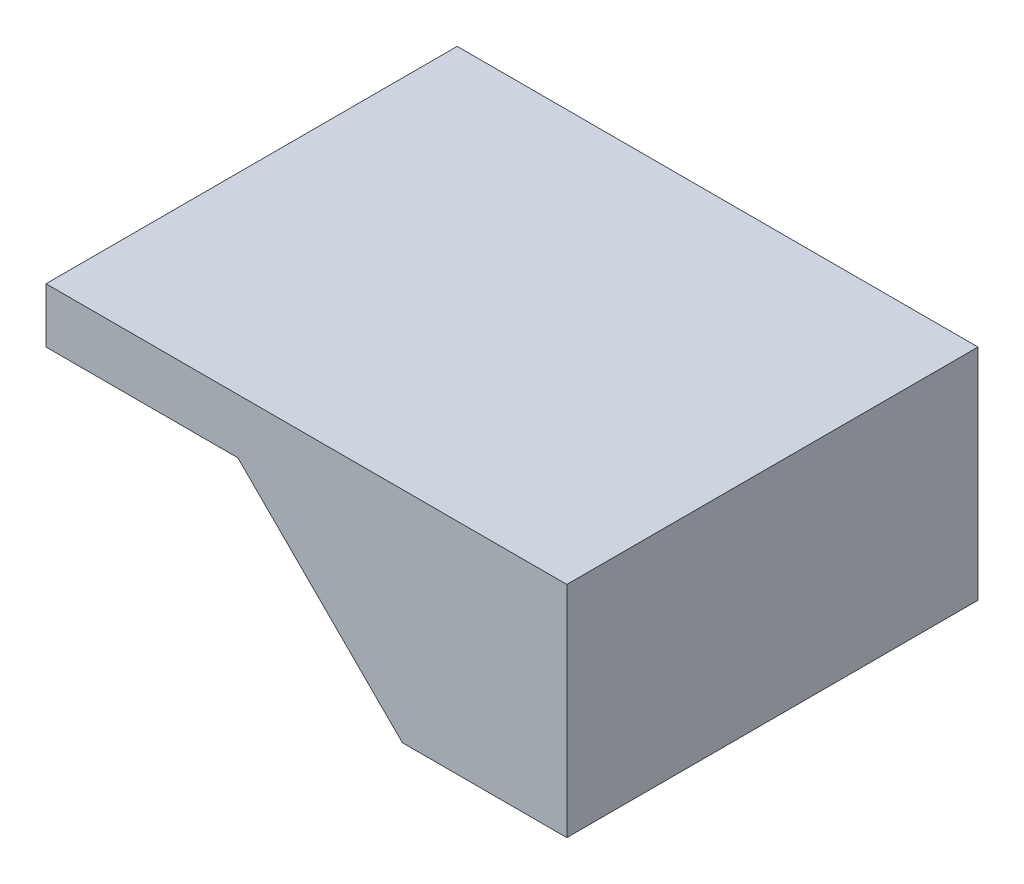
ISO-10303-21;
HEADER;
FILE_DESCRIPTION(('STEP AP214'),'2;1');
FILE_NAME('part.step','',(''),(''),'','','');
FILE_SCHEMA(('AUTOMOTIVE_DESIGN { 1 0 10303 214 1 1 1 1 }'));
ENDSEC;
DATA;
#1=APPLICATION_CONTEXT('core data for automotive mechanical design processes');
#2=APPLICATION_PROTOCOL_DEFINITION('international standard','automotive_design',2000,#1);
#3=PRODUCT_CONTEXT('',#1,'mechanical');
#4=PRODUCT('Part','Part','',(#3));
#5=PRODUCT_RELATED_PRODUCT_CATEGORY('part','',(#4));
#6=PRODUCT_DEFINITION_FORMATION('','',#4);
#7=PRODUCT_DEFINITION_CONTEXT('part definition',#1,'design');
#8=PRODUCT_DEFINITION('design','',#6,#7);
#9=PRODUCT_DEFINITION_SHAPE('','',#8);
#10=(LENGTH_UNIT() NAMED_UNIT(*) SI_UNIT(.MILLI.,.METRE.));
#11=(NAMED_UNIT(*) PLANE_ANGLE_UNIT() SI_UNIT($,.RADIAN.));
#12=(NAMED_UNIT(*) SI_UNIT($,.STERADIAN.) SOLID_ANGLE_UNIT());
#13=UNCERTAINTY_MEASURE_WITH_UNIT(LENGTH_MEASURE(1.E-05),#10,'distance_accuracy_value','');
#14=(GEOMETRIC_REPRESENTATION_CONTEXT(3) GLOBAL_UNCERTAINTY_ASSIGNED_CONTEXT((#13)) GLOBAL_UNIT_ASSIGNED_CONTEXT((#10,
#11,#12)) REPRESENTATION_CONTEXT('',''));
#15=CARTESIAN_POINT('',(0.,0.,0.));
#16=DIRECTION('',(0.,0.,1.));
#17=DIRECTION('',(1.,0.,0.));
#18=AXIS2_PLACEMENT_3D('',#15,#16,#17);
#19=CARTESIAN_POINT('',(69.9999999999988,0.,75.));
#20=DIRECTION('',(0.707106781186539,0.707106781186556,0.));
#21=DIRECTION('',(-0.707106781186556,0.707106781186539,0.));
#22=AXIS2_PLACEMENT_3D('',#19,#20,#21);
#23=PLANE('',#22);
#24=DIRECTION('',(0.,0.,1.));
#25=VECTOR('',#24,1.);
#26=CARTESIAN_POINT('',(130.,-60.,-165.553851381374));
#27=LINE('',#26,#25);
#28=CARTESIAN_POINT('',(130.,-60.,-75.));
#29=VERTEX_POINT('',#28);
#30=CARTESIAN_POINT('',(130.,-60.,-5.));
#31=VERTEX_POINT('',#30);
#32=EDGE_CURVE('E235',#29,#31,#27,.T.);
#33=ORIENTED_EDGE('',*,*,#32,.T.);
#34=DIRECTION('',(0.707106781186556,-0.707106781186539,0.));
#35=VECTOR('',#34,1.);
#36=CARTESIAN_POINT('',(69.9999999999988,0.,-5.));
#37=LINE('',#36,#35);
#38=CARTESIAN_POINT('',(69.9999999999988,0.,-5.));
#39=VERTEX_POINT('',#38);
#40=EDGE_CURVE('E187',#39,#31,#37,.T.);
#41=ORIENTED_EDGE('',*,*,#40,.F.);
#42=DIRECTION('',(0.,0.,-1.));
#43=VECTOR('',#42,1.);
#44=CARTESIAN_POINT('',(69.9999999999988,0.,75.));
#45=LINE('',#44,#43);
#46=CARTESIAN_POINT('',(69.9999999999988,0.,-75.));
#47=VERTEX_POINT('',#46);
#48=EDGE_CURVE('E171',#39,#47,#45,.T.);
#49=ORIENTED_EDGE('',*,*,#48,.T.);
#50=DIRECTION('',(0.707106781186556,-0.707106781186539,0.));
#51=VECTOR('',#50,1.);
#52=CARTESIAN_POINT('',(69.9999999999988,0.,-75.));
#53=LINE('',#52,#51);
#54=EDGE_CURVE('E159',#47,#29,#53,.T.);
#55=ORIENTED_EDGE('',*,*,#54,.T.);
#56=EDGE_LOOP('',(#33,#41,#49,#55));
#57=FACE_BOUND('',#56,.T.);
#58=ADVANCED_FACE('F39',(#57),#23,.F.);
#59=CARTESIAN_POINT('',(0.,0.,75.));
#60=DIRECTION('',(0.,1.,0.));
#61=DIRECTION('',(0.,0.,1.));
#62=AXIS2_PLACEMENT_3D('',#59,#60,#61);
#63=PLANE('',#62);
#64=DIRECTION('',(1.,0.,0.));
#65=VECTOR('',#64,1.);
#66=CARTESIAN_POINT('',(43.3578643762674,0.,5.));
#67=LINE('',#66,#65);
#68=CARTESIAN_POINT('',(62.9289321881332,0.,5.));
#69=VERTEX_POINT('',#68);
#70=CARTESIAN_POINT('',(69.9999999999988,0.,5.));
#71=VERTEX_POINT('',#70);
#72=EDGE_CURVE('E219',#69,#71,#67,.T.);
#73=ORIENTED_EDGE('',*,*,#72,.T.);
#74=CARTESIAN_POINT('',(69.9999999999988,0.,75.));
#75=VERTEX_POINT('',#74);
#76=EDGE_CURVE('E172',#75,#71,#45,.T.);
#77=ORIENTED_EDGE('',*,*,#76,.F.);
#78=DIRECTION('',(1.,0.,0.));
#79=VECTOR('',#78,1.);
#80=CARTESIAN_POINT('',(0.,0.,75.));
#81=LINE('',#80,#79);
#82=CARTESIAN_POINT('',(0.,0.,75.));
#83=VERTEX_POINT('',#82);
#84=EDGE_CURVE('E162',#83,#75,#81,.T.);
#85=ORIENTED_EDGE('',*,*,#84,.F.);
#86=DIRECTION('',(0.,0.,-1.));
#87=VECTOR('',#86,1.);
#88=CARTESIAN_POINT('',(0.,0.,75.));
#89=LINE('',#88,#87);
#90=CARTESIAN_POINT('',(0.,0.,-75.));
#91=VERTEX_POINT('',#90);
#92=EDGE_CURVE('E47',#83,#91,#89,.T.);
#93=ORIENTED_EDGE('',*,*,#92,.T.);
#94=DIRECTION('',(1.,0.,0.));
#95=VECTOR('',#94,1.);
#96=CARTESIAN_POINT('',(0.,0.,-75.));
#97=LINE('',#96,#95);
#98=EDGE_CURVE('E165',#91,#47,#97,.T.);
#99=ORIENTED_EDGE('',*,*,#98,.T.);
#100=ORIENTED_EDGE('',*,*,#48,.F.);
#101=DIRECTION('',(-1.,0.,0.));
#102=VECTOR('',#101,1.);
#103=CARTESIAN_POINT('',(43.3578643762674,0.,-4.99999999999999));
#104=LINE('',#103,#102);
#105=CARTESIAN_POINT('',(62.9289321881332,0.,-5.));
#106=VERTEX_POINT('',#105);
#107=EDGE_CURVE('E221',#39,#106,#104,.T.);
#108=ORIENTED_EDGE('',*,*,#107,.T.);
#109=DIRECTION('',(-0.577350269189625,0.,-0.816496580927727));
#110=VECTOR('',#109,1.);
#111=CARTESIAN_POINT('',(56.4052429175113,0.,-14.2258898432214));
#112=LINE('',#111,#110);
#113=CARTESIAN_POINT('',(59.3933982822004,0.,-10.));
#114=VERTEX_POINT('',#113);
#115=EDGE_CURVE('E224',#106,#114,#112,.T.);
#116=ORIENTED_EDGE('',*,*,#115,.T.);
#117=DIRECTION('',(-1.,0.,0.));
#118=VECTOR('',#117,1.);
#119=CARTESIAN_POINT('',(41.590097423301,0.,-10.));
#120=LINE('',#119,#118);
#121=CARTESIAN_POINT('',(55.8578643762677,0.,-10.));
#122=VERTEX_POINT('',#121);
#123=EDGE_CURVE('E227',#114,#122,#120,.T.);
#124=ORIENTED_EDGE('',*,*,#123,.T.);
#125=DIRECTION('',(0.,0.,1.));
#126=VECTOR('',#125,1.);
#127=CARTESIAN_POINT('',(55.8578643762677,0.,-10.));
#128=LINE('',#127,#126);
#129=CARTESIAN_POINT('',(55.8578643762677,0.,10.));
#130=VERTEX_POINT('',#129);
#131=EDGE_CURVE('E230',#122,#130,#128,.T.);
#132=ORIENTED_EDGE('',*,*,#131,.T.);
#133=DIRECTION('',(1.,0.,0.));
#134=VECTOR('',#133,1.);
#135=CARTESIAN_POINT('',(39.8223304703347,0.,9.99999999999999));
#136=LINE('',#135,#134);
#137=CARTESIAN_POINT('',(59.3933982822004,0.,10.));
#138=VERTEX_POINT('',#137);
#139=EDGE_CURVE('E196',#130,#138,#136,.T.);
#140=ORIENTED_EDGE('',*,*,#139,.T.);
#141=DIRECTION('',(0.577350269189625,0.,-0.816496580927727));
#142=VECTOR('',#141,1.);
#143=CARTESIAN_POINT('',(53.4589646625673,0.,18.392556509888));
#144=LINE('',#143,#142);
#145=EDGE_CURVE('E205',#138,#69,#144,.T.);
#146=ORIENTED_EDGE('',*,*,#145,.T.);
#147=EDGE_LOOP('',(#73,#77,#85,#93,#99,#100,#108,#116,#124,#132,#140,#146));
#148=FACE_BOUND('',#147,.T.);
#149=ADVANCED_FACE('F179',(#148),#63,.F.);
#150=DIRECTION('',(-0.707106781186556,0.707106781186539,0.));
#151=VECTOR('',#150,1.);
#152=CARTESIAN_POINT('',(69.9999999999988,0.,5.));
#153=LINE('',#152,#151);
#154=CARTESIAN_POINT('',(130.,-60.,5.));
#155=VERTEX_POINT('',#154);
#156=EDGE_CURVE('E185',#155,#71,#153,.T.);
#157=ORIENTED_EDGE('',*,*,#156,.F.);
#158=CARTESIAN_POINT('',(130.,-60.,75.));
#159=VERTEX_POINT('',#158);
#160=EDGE_CURVE('E238',#155,#159,#27,.T.);
#161=ORIENTED_EDGE('',*,*,#160,.T.);
#162=DIRECTION('',(0.707106781186556,-0.707106781186539,0.));
#163=VECTOR('',#162,1.);
#164=CARTESIAN_POINT('',(69.9999999999988,0.,75.));
#165=LINE('',#164,#163);
#166=EDGE_CURVE('E191',#75,#159,#165,.T.);
#167=ORIENTED_EDGE('',*,*,#166,.F.);
#168=ORIENTED_EDGE('',*,*,#76,.T.);
#169=EDGE_LOOP('',(#157,#161,#167,#168));
#170=FACE_BOUND('',#169,.T.);
#171=ADVANCED_FACE('F277',(#170),#23,.F.);
#172=CARTESIAN_POINT('',(0.,20.,75.));
#173=DIRECTION('',(1.,0.,0.));
#174=DIRECTION('',(0.,1.,0.));
#175=AXIS2_PLACEMENT_3D('',#172,#173,#174);
#176=PLANE('',#175);
#177=DIRECTION('',(0.,-1.,0.));
#178=VECTOR('',#177,1.);
#179=CARTESIAN_POINT('',(0.,20.,-75.));
#180=LINE('',#179,#178);
#181=CARTESIAN_POINT('',(0.,20.,-75.));
#182=VERTEX_POINT('',#181);
#183=EDGE_CURVE('E157',#182,#91,#180,.T.);
#184=ORIENTED_EDGE('',*,*,#183,.T.);
#185=ORIENTED_EDGE('',*,*,#92,.F.);
#186=DIRECTION('',(0.,-1.,0.));
#187=VECTOR('',#186,1.);
#188=CARTESIAN_POINT('',(0.,20.,75.));
#189=LINE('',#188,#187);
#190=CARTESIAN_POINT('',(0.,20.,75.));
#191=VERTEX_POINT('',#190);
#192=EDGE_CURVE('E158',#191,#83,#189,.T.);
#193=ORIENTED_EDGE('',*,*,#192,.F.);
#194=DIRECTION('',(0.,0.,-1.));
#195=VECTOR('',#194,1.);
#196=CARTESIAN_POINT('',(0.,20.,75.));
#197=LINE('',#196,#195);
#198=EDGE_CURVE('E169',#191,#182,#197,.T.);
#199=ORIENTED_EDGE('',*,*,#198,.T.);
#200=EDGE_LOOP('',(#184,#185,#193,#199));
#201=FACE_BOUND('',#200,.T.);
#202=ADVANCED_FACE('F41',(#201),#176,.F.);
#203=CARTESIAN_POINT('',(210.,20.,75.));
#204=DIRECTION('',(0.,-1.,0.));
#205=DIRECTION('',(1.,0.,0.));
#206=AXIS2_PLACEMENT_3D('',#203,#204,#205);
#207=PLANE('',#206);
#208=DIRECTION('',(-1.,0.,0.));
#209=VECTOR('',#208,1.);
#210=CARTESIAN_POINT('',(210.,20.,75.));
#211=LINE('',#210,#209);
#212=CARTESIAN_POINT('',(190.000000000025,20.,75.));
#213=VERTEX_POINT('',#212);
#214=EDGE_CURVE('E152',#213,#191,#211,.T.);
#215=ORIENTED_EDGE('',*,*,#214,.F.);
#216=DIRECTION('',(0.,0.,-1.));
#217=VECTOR('',#216,1.);
#218=CARTESIAN_POINT('',(190.000000000025,20.,75.));
#219=LINE('',#218,#217);
#220=CARTESIAN_POINT('',(190.000000000025,20.,-75.));
#221=VERTEX_POINT('',#220);
#222=EDGE_CURVE('E141',#213,#221,#219,.T.);
#223=ORIENTED_EDGE('',*,*,#222,.T.);
#224=DIRECTION('',(-1.,0.,0.));
#225=VECTOR('',#224,1.);
#226=CARTESIAN_POINT('',(210.,20.,-75.));
#227=LINE('',#226,#225);
#228=EDGE_CURVE('E150',#221,#182,#227,.T.);
#229=ORIENTED_EDGE('',*,*,#228,.T.);
#230=ORIENTED_EDGE('',*,*,#198,.F.);
#231=EDGE_LOOP('',(#215,#223,#229,#230));
#232=FACE_BOUND('',#231,.T.);
#233=ADVANCED_FACE('F148',(#232),#207,.F.);
#234=CARTESIAN_POINT('',(0.,0.,75.));
#235=DIRECTION('',(0.,0.,1.));
#236=DIRECTION('',(1.,0.,0.));
#237=AXIS2_PLACEMENT_3D('',#234,#235,#236);
#238=PLANE('',#237);
#239=DIRECTION('',(0.,-1.,0.));
#240=VECTOR('',#239,1.);
#241=CARTESIAN_POINT('',(190.000000000025,0.,75.));
#242=LINE('',#241,#240);
#243=CARTESIAN_POINT('',(190.000000000025,-60.,75.));
#244=VERTEX_POINT('',#243);
#245=EDGE_CURVE('E53',#213,#244,#242,.T.);
#246=ORIENTED_EDGE('',*,*,#245,.F.);
#247=ORIENTED_EDGE('',*,*,#214,.T.);
#248=ORIENTED_EDGE('',*,*,#192,.T.);
#249=ORIENTED_EDGE('',*,*,#84,.T.);
#250=ORIENTED_EDGE('',*,*,#166,.T.);
#251=DIRECTION('',(1.,0.,0.));
#252=VECTOR('',#251,1.);
#253=CARTESIAN_POINT('',(130.,-60.,75.));
#254=LINE('',#253,#252);
#255=EDGE_CURVE('E239',#159,#244,#254,.T.);
#256=ORIENTED_EDGE('',*,*,#255,.T.);
#257=EDGE_LOOP('',(#246,#247,#248,#249,#250,#256));
#258=FACE_BOUND('',#257,.T.);
#259=ADVANCED_FACE('F273',(#258),#238,.T.);
#260=CARTESIAN_POINT('',(0.,0.,-75.));
#261=DIRECTION('',(0.,0.,1.));
#262=DIRECTION('',(1.,0.,0.));
#263=AXIS2_PLACEMENT_3D('',#260,#261,#262);
#264=PLANE('',#263);
#265=ORIENTED_EDGE('',*,*,#228,.F.);
#266=DIRECTION('',(0.,-1.,0.));
#267=VECTOR('',#266,1.);
#268=CARTESIAN_POINT('',(190.000000000025,-122.124441258443,-75.));
#269=LINE('',#268,#267);
#270=CARTESIAN_POINT('',(190.000000000025,-60.,-75.));
#271=VERTEX_POINT('',#270);
#272=EDGE_CURVE('E138',#221,#271,#269,.T.);
#273=ORIENTED_EDGE('',*,*,#272,.T.);
#274=DIRECTION('',(-1.,0.,0.));
#275=VECTOR('',#274,1.);
#276=CARTESIAN_POINT('',(130.,-60.,-75.));
#277=LINE('',#276,#275);
#278=EDGE_CURVE('E201',#271,#29,#277,.T.);
#279=ORIENTED_EDGE('',*,*,#278,.T.);
#280=ORIENTED_EDGE('',*,*,#54,.F.);
#281=ORIENTED_EDGE('',*,*,#98,.F.);
#282=ORIENTED_EDGE('',*,*,#183,.F.);
#283=EDGE_LOOP('',(#265,#273,#279,#280,#281,#282));
#284=FACE_BOUND('',#283,.T.);
#285=ADVANCED_FACE('F155',(#284),#264,.F.);
#286=CARTESIAN_POINT('',(43.3578643762674,19.5710678118653,5.));
#287=DIRECTION('',(0.,0.,-1.));
#288=DIRECTION('',(0.,1.,0.));
#289=AXIS2_PLACEMENT_3D('',#286,#287,#288);
#290=PLANE('',#289);
#291=DIRECTION('',(0.707106781186556,-0.707106781186539,0.));
#292=VECTOR('',#291,1.);
#293=CARTESIAN_POINT('',(43.3578643762674,19.5710678118653,5.));
#294=LINE('',#293,#292);
#295=CARTESIAN_POINT('',(122.928932188135,-60.,5.));
#296=VERTEX_POINT('',#295);
#297=EDGE_CURVE('E197',#69,#296,#294,.T.);
#298=ORIENTED_EDGE('',*,*,#297,.T.);
#299=DIRECTION('',(1.,0.,0.));
#300=VECTOR('',#299,1.);
#301=CARTESIAN_POINT('',(43.3578643762674,-60.,5.));
#302=LINE('',#301,#300);
#303=EDGE_CURVE('E258',#296,#155,#302,.T.);
#304=ORIENTED_EDGE('',*,*,#303,.T.);
#305=ORIENTED_EDGE('',*,*,#156,.T.);
#306=ORIENTED_EDGE('',*,*,#72,.F.);
#307=EDGE_LOOP('',(#298,#304,#305,#306));
#308=FACE_BOUND('',#307,.T.);
#309=ADVANCED_FACE('F283',(#308),#290,.F.);
#310=CARTESIAN_POINT('',(43.3578643762674,19.5710678118653,-5.));
#311=DIRECTION('',(0.,0.,1.));
#312=DIRECTION('',(0.,-1.,0.));
#313=AXIS2_PLACEMENT_3D('',#310,#311,#312);
#314=PLANE('',#313);
#315=ORIENTED_EDGE('',*,*,#40,.T.);
#316=DIRECTION('',(-1.,0.,0.));
#317=VECTOR('',#316,1.);
#318=CARTESIAN_POINT('',(43.3578643762674,-60.,-4.99999999999998));
#319=LINE('',#318,#317);
#320=CARTESIAN_POINT('',(122.928932188135,-60.,-5.));
#321=VERTEX_POINT('',#320);
#322=EDGE_CURVE('E61',#31,#321,#319,.T.);
#323=ORIENTED_EDGE('',*,*,#322,.T.);
#324=DIRECTION('',(0.707106781186556,-0.707106781186539,0.));
#325=VECTOR('',#324,1.);
#326=CARTESIAN_POINT('',(43.3578643762674,19.5710678118653,-5.));
#327=LINE('',#326,#325);
#328=EDGE_CURVE('E200',#106,#321,#327,.T.);
#329=ORIENTED_EDGE('',*,*,#328,.F.);
#330=ORIENTED_EDGE('',*,*,#107,.F.);
#331=EDGE_LOOP('',(#315,#323,#329,#330));
#332=FACE_BOUND('',#331,.T.);
#333=ADVANCED_FACE('F263',(#332),#314,.F.);
#334=CARTESIAN_POINT('',(43.3578643762674,19.5710678118653,-5.));
#335=DIRECTION('',(-0.63245553203367,-0.632455532033686,0.447213595499952));
#336=DIRECTION('',(0.707106781186556,-0.707106781186539,0.));
#337=AXIS2_PLACEMENT_3D('',#334,#335,#336);
#338=PLANE('',#337);
#339=ORIENTED_EDGE('',*,*,#328,.T.);
#340=DIRECTION('',(-0.577350269189625,0.,-0.816496580927727));
#341=VECTOR('',#340,1.);
#342=CARTESIAN_POINT('',(96.4052429175123,-60.,-42.5101610906839));
#343=LINE('',#342,#341);
#344=CARTESIAN_POINT('',(119.393398282202,-60.,-10.));
#345=VERTEX_POINT('',#344);
#346=EDGE_CURVE('E242',#321,#345,#343,.T.);
#347=ORIENTED_EDGE('',*,*,#346,.T.);
#348=DIRECTION('',(0.707106781186556,-0.707106781186539,0.));
#349=VECTOR('',#348,1.);
#350=CARTESIAN_POINT('',(41.590097423301,17.803300858899,-10.));
#351=LINE('',#350,#349);
#352=EDGE_CURVE('E212',#114,#345,#351,.T.);
#353=ORIENTED_EDGE('',*,*,#352,.F.);
#354=ORIENTED_EDGE('',*,*,#115,.F.);
#355=EDGE_LOOP('',(#339,#347,#353,#354));
#356=FACE_BOUND('',#355,.T.);
#357=ADVANCED_FACE('F266',(#356),#338,.F.);
#358=CARTESIAN_POINT('',(41.590097423301,17.803300858899,-10.));
#359=DIRECTION('',(0.,0.,1.));
#360=DIRECTION('',(1.,0.,0.));
#361=AXIS2_PLACEMENT_3D('',#358,#359,#360);
#362=PLANE('',#361);
#363=ORIENTED_EDGE('',*,*,#352,.T.);
#364=DIRECTION('',(-1.,0.,0.));
#365=VECTOR('',#364,1.);
#366=CARTESIAN_POINT('',(41.590097423301,-60.,-10.));
#367=LINE('',#366,#365);
#368=CARTESIAN_POINT('',(115.857864376269,-60.,-10.));
#369=VERTEX_POINT('',#368);
#370=EDGE_CURVE('E246',#345,#369,#367,.T.);
#371=ORIENTED_EDGE('',*,*,#370,.T.);
#372=DIRECTION('',(0.707106781186556,-0.707106781186539,0.));
#373=VECTOR('',#372,1.);
#374=CARTESIAN_POINT('',(39.8223304703347,16.0355339059326,-10.));
#375=LINE('',#374,#373);
#376=EDGE_CURVE('E209',#122,#369,#375,.T.);
#377=ORIENTED_EDGE('',*,*,#376,.F.);
#378=ORIENTED_EDGE('',*,*,#123,.F.);
#379=EDGE_LOOP('',(#363,#371,#377,#378));
#380=FACE_BOUND('',#379,.T.);
#381=ADVANCED_FACE('F291',(#380),#362,.F.);
#382=CARTESIAN_POINT('',(39.8223304703347,16.0355339059326,-10.));
#383=DIRECTION('',(0.707106781186539,0.707106781186556,0.));
#384=DIRECTION('',(-0.707106781186556,0.707106781186539,0.));
#385=AXIS2_PLACEMENT_3D('',#382,#383,#384);
#386=PLANE('',#385);
#387=ORIENTED_EDGE('',*,*,#376,.T.);
#388=DIRECTION('',(0.,0.,1.));
#389=VECTOR('',#388,1.);
#390=CARTESIAN_POINT('',(115.857864376269,-60.,-10.));
#391=LINE('',#390,#389);
#392=CARTESIAN_POINT('',(115.857864376269,-60.,10.));
#393=VERTEX_POINT('',#392);
#394=EDGE_CURVE('E249',#369,#393,#391,.T.);
#395=ORIENTED_EDGE('',*,*,#394,.T.);
#396=DIRECTION('',(0.707106781186556,-0.707106781186539,0.));
#397=VECTOR('',#396,1.);
#398=CARTESIAN_POINT('',(39.8223304703347,16.0355339059326,10.));
#399=LINE('',#398,#397);
#400=EDGE_CURVE('E206',#130,#393,#399,.T.);
#401=ORIENTED_EDGE('',*,*,#400,.F.);
#402=ORIENTED_EDGE('',*,*,#131,.F.);
#403=EDGE_LOOP('',(#387,#395,#401,#402));
#404=FACE_BOUND('',#403,.T.);
#405=ADVANCED_FACE('F288',(#404),#386,.F.);
#406=CARTESIAN_POINT('',(39.8223304703347,16.0355339059326,10.));
#407=DIRECTION('',(0.,0.,-1.));
#408=DIRECTION('',(0.,1.,0.));
#409=AXIS2_PLACEMENT_3D('',#406,#407,#408);
#410=PLANE('',#409);
#411=ORIENTED_EDGE('',*,*,#400,.T.);
#412=DIRECTION('',(1.,0.,0.));
#413=VECTOR('',#412,1.);
#414=CARTESIAN_POINT('',(39.8223304703347,-60.,9.99999999999996));
#415=LINE('',#414,#413);
#416=CARTESIAN_POINT('',(119.393398282202,-60.,10.));
#417=VERTEX_POINT('',#416);
#418=EDGE_CURVE('E252',#393,#417,#415,.T.);
#419=ORIENTED_EDGE('',*,*,#418,.T.);
#420=DIRECTION('',(0.707106781186556,-0.707106781186539,0.));
#421=VECTOR('',#420,1.);
#422=CARTESIAN_POINT('',(41.590097423301,17.803300858899,10.));
#423=LINE('',#422,#421);
#424=EDGE_CURVE('E202',#138,#417,#423,.T.);
#425=ORIENTED_EDGE('',*,*,#424,.F.);
#426=ORIENTED_EDGE('',*,*,#139,.F.);
#427=EDGE_LOOP('',(#411,#419,#425,#426));
#428=FACE_BOUND('',#427,.T.);
#429=ADVANCED_FACE('F286',(#428),#410,.F.);
#430=CARTESIAN_POINT('',(41.590097423301,17.803300858899,10.));
#431=DIRECTION('',(-0.63245553203367,-0.632455532033686,-0.447213595499952));
#432=DIRECTION('',(0.707106781186556,-0.707106781186539,0.));
#433=AXIS2_PLACEMENT_3D('',#430,#431,#432);
#434=PLANE('',#433);
#435=ORIENTED_EDGE('',*,*,#424,.T.);
#436=DIRECTION('',(0.577350269189625,0.,-0.816496580927727));
#437=VECTOR('',#436,1.);
#438=CARTESIAN_POINT('',(93.4589646625684,-60.,46.6768277573506));
#439=LINE('',#438,#437);
#440=EDGE_CURVE('E255',#417,#296,#439,.T.);
#441=ORIENTED_EDGE('',*,*,#440,.T.);
#442=ORIENTED_EDGE('',*,*,#297,.F.);
#443=ORIENTED_EDGE('',*,*,#145,.F.);
#444=EDGE_LOOP('',(#435,#441,#442,#443));
#445=FACE_BOUND('',#444,.T.);
#446=ADVANCED_FACE('F280',(#445),#434,.F.);
#447=CARTESIAN_POINT('',(130.,-60.,-165.553851381374));
#448=DIRECTION('',(0.,-1.,0.));
#449=DIRECTION('',(0.,0.,-1.));
#450=AXIS2_PLACEMENT_3D('',#447,#448,#449);
#451=PLANE('',#450);
#452=DIRECTION('',(0.,0.,-1.));
#453=VECTOR('',#452,1.);
#454=CARTESIAN_POINT('',(190.000000000025,-60.,-165.553851381374));
#455=LINE('',#454,#453);
#456=EDGE_CURVE('E11',#244,#271,#455,.T.);
#457=ORIENTED_EDGE('',*,*,#456,.F.);
#458=ORIENTED_EDGE('',*,*,#255,.F.);
#459=ORIENTED_EDGE('',*,*,#160,.F.);
#460=ORIENTED_EDGE('',*,*,#303,.F.);
#461=ORIENTED_EDGE('',*,*,#440,.F.);
#462=ORIENTED_EDGE('',*,*,#418,.F.);
#463=ORIENTED_EDGE('',*,*,#394,.F.);
#464=ORIENTED_EDGE('',*,*,#370,.F.);
#465=ORIENTED_EDGE('',*,*,#346,.F.);
#466=ORIENTED_EDGE('',*,*,#322,.F.);
#467=ORIENTED_EDGE('',*,*,#32,.F.);
#468=ORIENTED_EDGE('',*,*,#278,.F.);
#469=EDGE_LOOP('',(#457,#458,#459,#460,#461,#462,#463,#464,#465,#466,#467,#468));
#470=FACE_BOUND('',#469,.T.);
#471=ADVANCED_FACE('F269',(#470),#451,.T.);
#472=CARTESIAN_POINT('',(190.000000000025,-122.124441258443,-75.));
#473=DIRECTION('',(-1.,0.,0.));
#474=DIRECTION('',(0.,0.,1.));
#475=AXIS2_PLACEMENT_3D('',#472,#473,#474);
#476=PLANE('',#475);
#477=ORIENTED_EDGE('',*,*,#245,.T.);
#478=ORIENTED_EDGE('',*,*,#456,.T.);
#479=ORIENTED_EDGE('',*,*,#272,.F.);
#480=ORIENTED_EDGE('',*,*,#222,.F.);
#481=EDGE_LOOP('',(#477,#478,#479,#480));
#482=FACE_BOUND('',#481,.T.);
#483=ADVANCED_FACE('F140',(#482),#476,.F.);
#484=CLOSED_SHELL('',(#58,#149,#171,#202,#233,#259,#285,#309,#333,#357,#381,#405,#429,#446,#471,#483));
#485=MANIFOLD_SOLID_BREP('B2',#484);
#486=ADVANCED_BREP_SHAPE_REPRESENTATION('',(#18,#485),#14);
#487=SHAPE_DEFINITION_REPRESENTATION(#9,#486);
ENDSEC;
END-ISO-10303-21;
